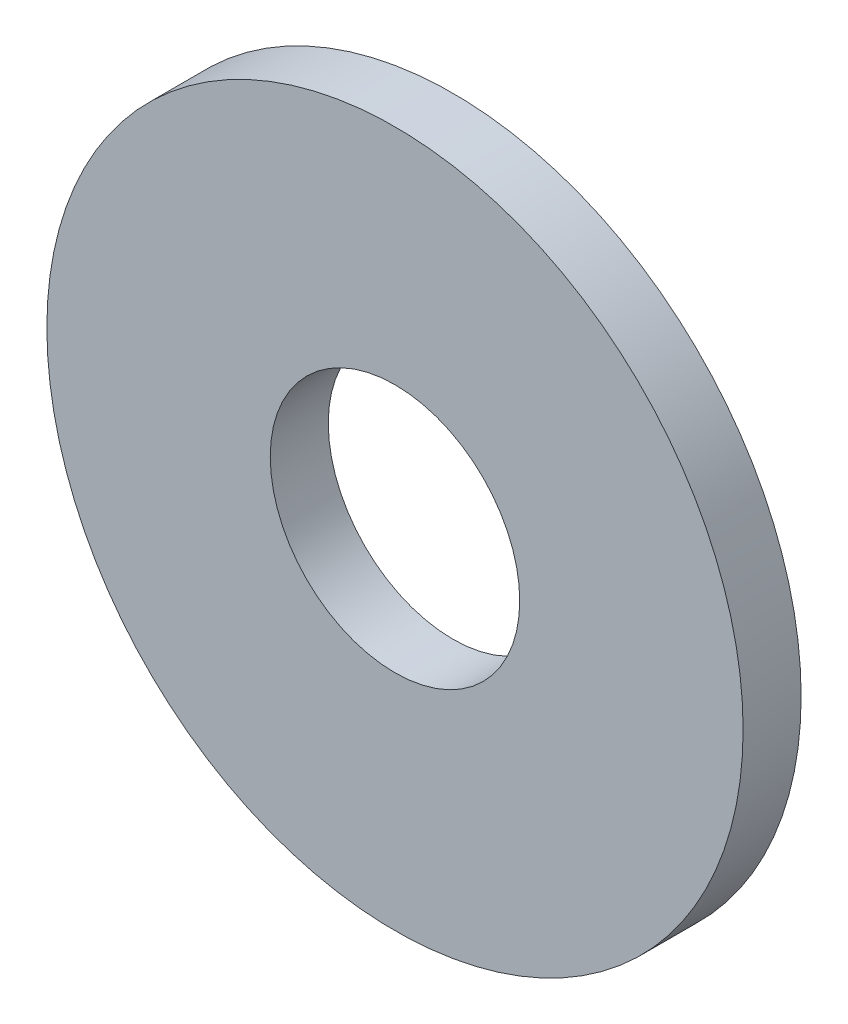
ISO-10303-21;
HEADER;
FILE_DESCRIPTION(('STEP AP214'),'2;1');
FILE_NAME('part.step','',(''),(''),'','','');
FILE_SCHEMA(('AUTOMOTIVE_DESIGN { 1 0 10303 214 1 1 1 1 }'));
ENDSEC;
DATA;
#1=APPLICATION_CONTEXT('core data for automotive mechanical design processes');
#2=APPLICATION_PROTOCOL_DEFINITION('international standard','automotive_design',2000,#1);
#3=PRODUCT_CONTEXT('',#1,'mechanical');
#4=PRODUCT('Part','Part','',(#3));
#5=PRODUCT_RELATED_PRODUCT_CATEGORY('part','',(#4));
#6=PRODUCT_DEFINITION_FORMATION('','',#4);
#7=PRODUCT_DEFINITION_CONTEXT('part definition',#1,'design');
#8=PRODUCT_DEFINITION('design','',#6,#7);
#9=PRODUCT_DEFINITION_SHAPE('','',#8);
#10=(LENGTH_UNIT() NAMED_UNIT(*) SI_UNIT(.MILLI.,.METRE.));
#11=(NAMED_UNIT(*) PLANE_ANGLE_UNIT() SI_UNIT($,.RADIAN.));
#12=(NAMED_UNIT(*) SI_UNIT($,.STERADIAN.) SOLID_ANGLE_UNIT());
#13=UNCERTAINTY_MEASURE_WITH_UNIT(LENGTH_MEASURE(1.E-05),#10,'distance_accuracy_value','');
#14=(GEOMETRIC_REPRESENTATION_CONTEXT(3) GLOBAL_UNCERTAINTY_ASSIGNED_CONTEXT((#13)) GLOBAL_UNIT_ASSIGNED_CONTEXT((#10,
#11,#12)) REPRESENTATION_CONTEXT('',''));
#15=CARTESIAN_POINT('',(0.,0.,0.));
#16=DIRECTION('',(0.,0.,1.));
#17=DIRECTION('',(1.,0.,0.));
#18=AXIS2_PLACEMENT_3D('',#15,#16,#17);
#19=CARTESIAN_POINT('',(0.,0.,1.));
#20=DIRECTION('',(0.,0.,1.));
#21=DIRECTION('',(1.,0.,0.));
#22=AXIS2_PLACEMENT_3D('',#19,#20,#21);
#23=PLANE('',#22);
#24=CARTESIAN_POINT('',(0.,0.,1.));
#25=DIRECTION('',(0.,0.,1.));
#26=DIRECTION('',(1.,0.,0.));
#27=AXIS2_PLACEMENT_3D('',#24,#25,#26);
#28=CIRCLE('',#27,6.);
#29=CARTESIAN_POINT('',(6.,0.,1.));
#30=VERTEX_POINT('',#29);
#31=EDGE_CURVE('E10',#30,#30,#28,.T.);
#32=ORIENTED_EDGE('',*,*,#31,.T.);
#33=EDGE_LOOP('',(#32));
#34=FACE_BOUND('',#33,.T.);
#35=CARTESIAN_POINT('',(0.,0.,1.));
#36=DIRECTION('',(0.,0.,1.));
#37=DIRECTION('',(1.,0.,0.));
#38=AXIS2_PLACEMENT_3D('',#35,#36,#37);
#39=CIRCLE('',#38,2.15);
#40=CARTESIAN_POINT('',(2.15,0.,1.));
#41=VERTEX_POINT('',#40);
#42=EDGE_CURVE('E44',#41,#41,#39,.T.);
#43=ORIENTED_EDGE('',*,*,#42,.F.);
#44=EDGE_LOOP('',(#43));
#45=FACE_BOUND('',#44,.T.);
#46=ADVANCED_FACE('F33',(#34,#45),#23,.T.);
#47=CARTESIAN_POINT('',(0.,0.,0.));
#48=DIRECTION('',(0.,0.,1.));
#49=DIRECTION('',(1.,0.,0.));
#50=AXIS2_PLACEMENT_3D('',#47,#48,#49);
#51=PLANE('',#50);
#52=CARTESIAN_POINT('',(0.,0.,0.));
#53=DIRECTION('',(0.,0.,1.));
#54=DIRECTION('',(1.,0.,0.));
#55=AXIS2_PLACEMENT_3D('',#52,#53,#54);
#56=CIRCLE('',#55,6.);
#57=CARTESIAN_POINT('',(6.,0.,0.));
#58=VERTEX_POINT('',#57);
#59=EDGE_CURVE('E37',#58,#58,#56,.T.);
#60=ORIENTED_EDGE('',*,*,#59,.F.);
#61=EDGE_LOOP('',(#60));
#62=FACE_BOUND('',#61,.T.);
#63=CARTESIAN_POINT('',(0.,0.,0.));
#64=DIRECTION('',(0.,0.,1.));
#65=DIRECTION('',(1.,0.,0.));
#66=AXIS2_PLACEMENT_3D('',#63,#64,#65);
#67=CIRCLE('',#66,2.15);
#68=CARTESIAN_POINT('',(2.15,0.,0.));
#69=VERTEX_POINT('',#68);
#70=EDGE_CURVE('E46',#69,#69,#67,.T.);
#71=ORIENTED_EDGE('',*,*,#70,.T.);
#72=EDGE_LOOP('',(#71));
#73=FACE_BOUND('',#72,.T.);
#74=ADVANCED_FACE('F56',(#62,#73),#51,.F.);
#75=CARTESIAN_POINT('',(0.,0.,1.));
#76=DIRECTION('',(0.,0.,-1.));
#77=DIRECTION('',(-1.,0.,0.));
#78=AXIS2_PLACEMENT_3D('',#75,#76,#77);
#79=CYLINDRICAL_SURFACE('',#78,6.);
#80=ORIENTED_EDGE('',*,*,#31,.F.);
#81=EDGE_LOOP('',(#80));
#82=FACE_BOUND('',#81,.T.);
#83=ORIENTED_EDGE('',*,*,#59,.T.);
#84=EDGE_LOOP('',(#83));
#85=FACE_BOUND('',#84,.T.);
#86=ADVANCED_FACE('F35',(#82,#85),#79,.T.);
#87=CARTESIAN_POINT('',(0.,0.,1.));
#88=DIRECTION('',(0.,0.,-1.));
#89=DIRECTION('',(-1.,0.,0.));
#90=AXIS2_PLACEMENT_3D('',#87,#88,#89);
#91=CYLINDRICAL_SURFACE('',#90,2.15);
#92=ORIENTED_EDGE('',*,*,#42,.T.);
#93=EDGE_LOOP('',(#92));
#94=FACE_BOUND('',#93,.T.);
#95=ORIENTED_EDGE('',*,*,#70,.F.);
#96=EDGE_LOOP('',(#95));
#97=FACE_BOUND('',#96,.T.);
#98=ADVANCED_FACE('F52',(#94,#97),#91,.F.);
#99=CLOSED_SHELL('',(#46,#74,#86,#98));
#100=MANIFOLD_SOLID_BREP('B2',#99);
#101=ADVANCED_BREP_SHAPE_REPRESENTATION('',(#18,#100),#14);
#102=SHAPE_DEFINITION_REPRESENTATION(#9,#101);
ENDSEC;
END-ISO-10303-21;
